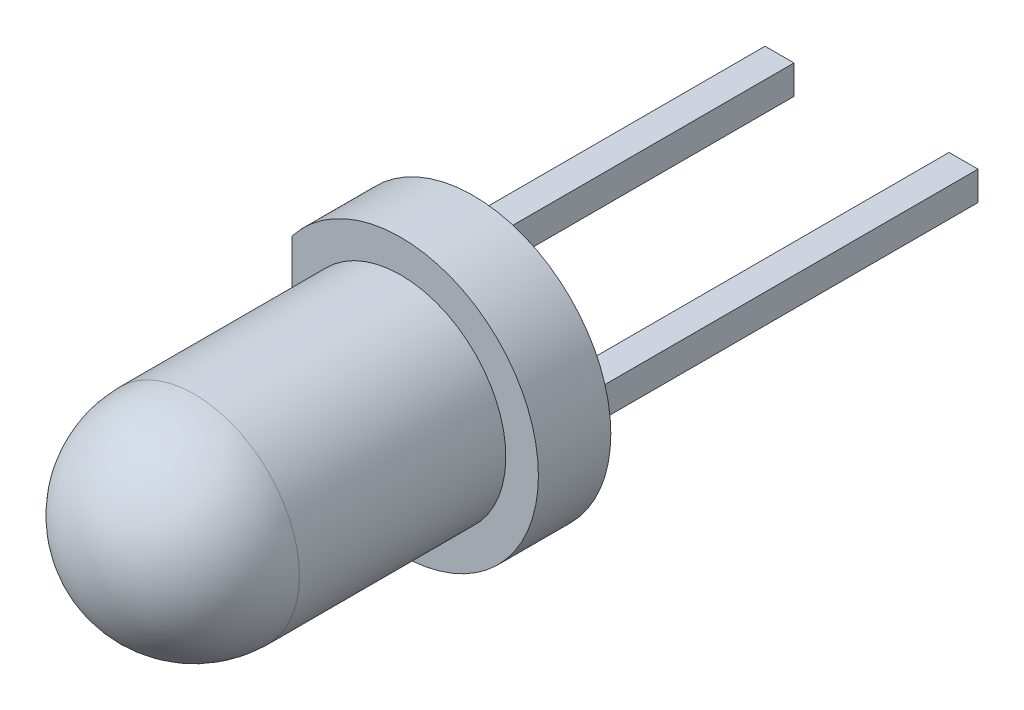
ISO-10303-21;
HEADER;
FILE_DESCRIPTION(('STEP AP214'),'2;1');
FILE_NAME('part.step','',(''),(''),'','','');
FILE_SCHEMA(('AUTOMOTIVE_DESIGN { 1 0 10303 214 1 1 1 1 }'));
ENDSEC;
DATA;
#1=APPLICATION_CONTEXT('core data for automotive mechanical design processes');
#2=APPLICATION_PROTOCOL_DEFINITION('international standard','automotive_design',2000,#1);
#3=PRODUCT_CONTEXT('',#1,'mechanical');
#4=PRODUCT('Part','Part','',(#3));
#5=PRODUCT_RELATED_PRODUCT_CATEGORY('part','',(#4));
#6=PRODUCT_DEFINITION_FORMATION('','',#4);
#7=PRODUCT_DEFINITION_CONTEXT('part definition',#1,'design');
#8=PRODUCT_DEFINITION('design','',#6,#7);
#9=PRODUCT_DEFINITION_SHAPE('','',#8);
#10=(LENGTH_UNIT() NAMED_UNIT(*) SI_UNIT(.MILLI.,.METRE.));
#11=(NAMED_UNIT(*) PLANE_ANGLE_UNIT() SI_UNIT($,.RADIAN.));
#12=(NAMED_UNIT(*) SI_UNIT($,.STERADIAN.) SOLID_ANGLE_UNIT());
#13=UNCERTAINTY_MEASURE_WITH_UNIT(LENGTH_MEASURE(1.E-05),#10,'distance_accuracy_value','');
#14=(GEOMETRIC_REPRESENTATION_CONTEXT(3) GLOBAL_UNCERTAINTY_ASSIGNED_CONTEXT((#13)) GLOBAL_UNIT_ASSIGNED_CONTEXT((#10,
#11,#12)) REPRESENTATION_CONTEXT('',''));
#15=CARTESIAN_POINT('',(0.,0.,0.));
#16=DIRECTION('',(0.,0.,1.));
#17=DIRECTION('',(1.,0.,0.));
#18=AXIS2_PLACEMENT_3D('',#15,#16,#17);
#19=CARTESIAN_POINT('',(73.2,46.9,3.5));
#20=DIRECTION('',(-1.,0.,0.));
#21=DIRECTION('',(0.,0.,1.));
#22=AXIS2_PLACEMENT_3D('',#19,#20,#21);
#23=PLANE('',#22);
#24=DIRECTION('',(0.,1.,0.));
#25=VECTOR('',#24,1.);
#26=CARTESIAN_POINT('',(73.2,46.9,-2.5));
#27=LINE('',#26,#25);
#28=CARTESIAN_POINT('',(73.2,46.5,-2.5));
#29=VERTEX_POINT('',#28);
#30=CARTESIAN_POINT('',(73.2,46.9,-2.5));
#31=VERTEX_POINT('',#30);
#32=EDGE_CURVE('E127',#29,#31,#27,.T.);
#33=ORIENTED_EDGE('',*,*,#32,.T.);
#34=DIRECTION('',(0.,0.,-1.));
#35=VECTOR('',#34,1.);
#36=CARTESIAN_POINT('',(73.2,46.9,3.5));
#37=LINE('',#36,#35);
#38=CARTESIAN_POINT('',(73.2,46.9,3.));
#39=VERTEX_POINT('',#38);
#40=EDGE_CURVE('E119',#31,#39,#37,.F.);
#41=ORIENTED_EDGE('',*,*,#40,.T.);
#42=DIRECTION('',(0.,1.,0.));
#43=VECTOR('',#42,1.);
#44=CARTESIAN_POINT('',(73.2,46.9,3.));
#45=LINE('',#44,#43);
#46=CARTESIAN_POINT('',(73.2,46.5,3.));
#47=VERTEX_POINT('',#46);
#48=EDGE_CURVE('E110',#47,#39,#45,.T.);
#49=ORIENTED_EDGE('',*,*,#48,.F.);
#50=DIRECTION('',(0.,0.,1.));
#51=VECTOR('',#50,1.);
#52=CARTESIAN_POINT('',(73.2,46.5,3.5));
#53=LINE('',#52,#51);
#54=EDGE_CURVE('E103',#47,#29,#53,.F.);
#55=ORIENTED_EDGE('',*,*,#54,.T.);
#56=EDGE_LOOP('',(#33,#41,#49,#55));
#57=FACE_BOUND('',#56,.T.);
#58=ADVANCED_FACE('F17',(#57),#23,.F.);
#59=CARTESIAN_POINT('',(75.74,46.5,3.5));
#60=DIRECTION('',(0.,1.,0.));
#61=DIRECTION('',(0.,0.,1.));
#62=AXIS2_PLACEMENT_3D('',#59,#60,#61);
#63=PLANE('',#62);
#64=DIRECTION('',(1.,0.,0.));
#65=VECTOR('',#64,1.);
#66=CARTESIAN_POINT('',(75.34,46.5,-2.5));
#67=LINE('',#66,#65);
#68=CARTESIAN_POINT('',(75.34,46.5,-2.5));
#69=VERTEX_POINT('',#68);
#70=CARTESIAN_POINT('',(75.74,46.5,-2.5));
#71=VERTEX_POINT('',#70);
#72=EDGE_CURVE('E171',#69,#71,#67,.T.);
#73=ORIENTED_EDGE('',*,*,#72,.T.);
#74=DIRECTION('',(0.,0.,1.));
#75=VECTOR('',#74,1.);
#76=CARTESIAN_POINT('',(75.74,46.5,3.5));
#77=LINE('',#76,#75);
#78=CARTESIAN_POINT('',(75.74,46.5,3.));
#79=VERTEX_POINT('',#78);
#80=EDGE_CURVE('E164',#71,#79,#77,.T.);
#81=ORIENTED_EDGE('',*,*,#80,.T.);
#82=DIRECTION('',(1.,0.,0.));
#83=VECTOR('',#82,1.);
#84=CARTESIAN_POINT('',(75.74,46.5,3.));
#85=LINE('',#84,#83);
#86=CARTESIAN_POINT('',(75.34,46.5,3.));
#87=VERTEX_POINT('',#86);
#88=EDGE_CURVE('E116',#87,#79,#85,.T.);
#89=ORIENTED_EDGE('',*,*,#88,.F.);
#90=DIRECTION('',(0.,0.,-1.));
#91=VECTOR('',#90,1.);
#92=CARTESIAN_POINT('',(75.34,46.5,3.5));
#93=LINE('',#92,#91);
#94=EDGE_CURVE('E176',#87,#69,#93,.T.);
#95=ORIENTED_EDGE('',*,*,#94,.T.);
#96=EDGE_LOOP('',(#73,#81,#89,#95));
#97=FACE_BOUND('',#96,.T.);
#98=ADVANCED_FACE('F238',(#97),#63,.F.);
#99=CARTESIAN_POINT('',(73.2,46.5,3.5));
#100=DIRECTION('',(0.,1.,0.));
#101=DIRECTION('',(0.,0.,1.));
#102=AXIS2_PLACEMENT_3D('',#99,#100,#101);
#103=PLANE('',#102);
#104=DIRECTION('',(1.,0.,0.));
#105=VECTOR('',#104,1.);
#106=CARTESIAN_POINT('',(72.8,46.5,-2.5));
#107=LINE('',#106,#105);
#108=CARTESIAN_POINT('',(72.8,46.5,-2.5));
#109=VERTEX_POINT('',#108);
#110=EDGE_CURVE('E124',#109,#29,#107,.T.);
#111=ORIENTED_EDGE('',*,*,#110,.T.);
#112=ORIENTED_EDGE('',*,*,#54,.F.);
#113=DIRECTION('',(1.,0.,0.));
#114=VECTOR('',#113,1.);
#115=CARTESIAN_POINT('',(73.2,46.5,3.));
#116=LINE('',#115,#114);
#117=CARTESIAN_POINT('',(72.8,46.5,3.));
#118=VERTEX_POINT('',#117);
#119=EDGE_CURVE('E108',#118,#47,#116,.T.);
#120=ORIENTED_EDGE('',*,*,#119,.F.);
#121=DIRECTION('',(0.,0.,-1.));
#122=VECTOR('',#121,1.);
#123=CARTESIAN_POINT('',(72.8,46.5,3.5));
#124=LINE('',#123,#122);
#125=EDGE_CURVE('E162',#118,#109,#124,.T.);
#126=ORIENTED_EDGE('',*,*,#125,.T.);
#127=EDGE_LOOP('',(#111,#112,#120,#126));
#128=FACE_BOUND('',#127,.T.);
#129=ADVANCED_FACE('F122',(#128),#103,.F.);
#130=CARTESIAN_POINT('',(72.8,46.9,-2.5));
#131=DIRECTION('',(0.,0.,1.));
#132=DIRECTION('',(1.,0.,0.));
#133=AXIS2_PLACEMENT_3D('',#130,#131,#132);
#134=PLANE('',#133);
#135=ORIENTED_EDGE('',*,*,#32,.F.);
#136=ORIENTED_EDGE('',*,*,#110,.F.);
#137=DIRECTION('',(0.,1.,0.));
#138=VECTOR('',#137,1.);
#139=CARTESIAN_POINT('',(72.8,46.5,-2.5));
#140=LINE('',#139,#138);
#141=CARTESIAN_POINT('',(72.8,46.9,-2.5));
#142=VERTEX_POINT('',#141);
#143=EDGE_CURVE('E160',#109,#142,#140,.T.);
#144=ORIENTED_EDGE('',*,*,#143,.T.);
#145=DIRECTION('',(1.,0.,0.));
#146=VECTOR('',#145,1.);
#147=CARTESIAN_POINT('',(72.8,46.9,-2.5));
#148=LINE('',#147,#146);
#149=EDGE_CURVE('E181',#142,#31,#148,.T.);
#150=ORIENTED_EDGE('',*,*,#149,.T.);
#151=EDGE_LOOP('',(#135,#136,#144,#150));
#152=FACE_BOUND('',#151,.T.);
#153=ADVANCED_FACE('F187',(#152),#134,.F.);
#154=CARTESIAN_POINT('',(72.8,46.9,3.5));
#155=DIRECTION('',(0.,-1.,0.));
#156=DIRECTION('',(0.,0.,-1.));
#157=AXIS2_PLACEMENT_3D('',#154,#155,#156);
#158=PLANE('',#157);
#159=ORIENTED_EDGE('',*,*,#149,.F.);
#160=DIRECTION('',(0.,0.,-1.));
#161=VECTOR('',#160,1.);
#162=CARTESIAN_POINT('',(72.8,46.9,3.5));
#163=LINE('',#162,#161);
#164=CARTESIAN_POINT('',(72.8,46.9,3.));
#165=VERTEX_POINT('',#164);
#166=EDGE_CURVE('E157',#142,#165,#163,.F.);
#167=ORIENTED_EDGE('',*,*,#166,.T.);
#168=DIRECTION('',(1.,0.,0.));
#169=VECTOR('',#168,1.);
#170=CARTESIAN_POINT('',(72.8,46.9,3.));
#171=LINE('',#170,#169);
#172=EDGE_CURVE('E184',#39,#165,#171,.F.);
#173=ORIENTED_EDGE('',*,*,#172,.F.);
#174=ORIENTED_EDGE('',*,*,#40,.F.);
#175=EDGE_LOOP('',(#159,#167,#173,#174));
#176=FACE_BOUND('',#175,.T.);
#177=ADVANCED_FACE('F191',(#176),#158,.F.);
#178=CARTESIAN_POINT('',(75.34,46.5,3.5));
#179=DIRECTION('',(1.,0.,0.));
#180=DIRECTION('',(0.,0.,-1.));
#181=AXIS2_PLACEMENT_3D('',#178,#179,#180);
#182=PLANE('',#181);
#183=DIRECTION('',(0.,1.,0.));
#184=VECTOR('',#183,1.);
#185=CARTESIAN_POINT('',(75.34,46.9,-2.5));
#186=LINE('',#185,#184);
#187=CARTESIAN_POINT('',(75.34,46.9,-2.5));
#188=VERTEX_POINT('',#187);
#189=EDGE_CURVE('E173',#188,#69,#186,.F.);
#190=ORIENTED_EDGE('',*,*,#189,.T.);
#191=ORIENTED_EDGE('',*,*,#94,.F.);
#192=DIRECTION('',(0.,1.,0.));
#193=VECTOR('',#192,1.);
#194=CARTESIAN_POINT('',(75.34,46.5,3.));
#195=LINE('',#194,#193);
#196=CARTESIAN_POINT('',(75.34,46.9,3.));
#197=VERTEX_POINT('',#196);
#198=EDGE_CURVE('E178',#197,#87,#195,.F.);
#199=ORIENTED_EDGE('',*,*,#198,.F.);
#200=DIRECTION('',(0.,0.,-1.));
#201=VECTOR('',#200,1.);
#202=CARTESIAN_POINT('',(75.34,46.9,3.5));
#203=LINE('',#202,#201);
#204=EDGE_CURVE('E155',#197,#188,#203,.T.);
#205=ORIENTED_EDGE('',*,*,#204,.T.);
#206=EDGE_LOOP('',(#190,#191,#199,#205));
#207=FACE_BOUND('',#206,.T.);
#208=ADVANCED_FACE('F228',(#207),#182,.F.);
#209=CARTESIAN_POINT('',(75.34,46.9,-2.5));
#210=DIRECTION('',(0.,0.,1.));
#211=DIRECTION('',(1.,0.,0.));
#212=AXIS2_PLACEMENT_3D('',#209,#210,#211);
#213=PLANE('',#212);
#214=DIRECTION('',(0.,1.,0.));
#215=VECTOR('',#214,1.);
#216=CARTESIAN_POINT('',(75.74,46.9,-2.5));
#217=LINE('',#216,#215);
#218=CARTESIAN_POINT('',(75.74,46.9,-2.5));
#219=VERTEX_POINT('',#218);
#220=EDGE_CURVE('E167',#219,#71,#217,.F.);
#221=ORIENTED_EDGE('',*,*,#220,.T.);
#222=ORIENTED_EDGE('',*,*,#72,.F.);
#223=ORIENTED_EDGE('',*,*,#189,.F.);
#224=DIRECTION('',(1.,0.,0.));
#225=VECTOR('',#224,1.);
#226=CARTESIAN_POINT('',(75.34,46.9,-2.5));
#227=LINE('',#226,#225);
#228=EDGE_CURVE('E153',#188,#219,#227,.T.);
#229=ORIENTED_EDGE('',*,*,#228,.T.);
#230=EDGE_LOOP('',(#221,#222,#223,#229));
#231=FACE_BOUND('',#230,.T.);
#232=ADVANCED_FACE('F224',(#231),#213,.F.);
#233=CARTESIAN_POINT('',(75.74,46.9,3.5));
#234=DIRECTION('',(-1.,0.,0.));
#235=DIRECTION('',(0.,0.,1.));
#236=AXIS2_PLACEMENT_3D('',#233,#234,#235);
#237=PLANE('',#236);
#238=ORIENTED_EDGE('',*,*,#220,.F.);
#239=DIRECTION('',(0.,0.,-1.));
#240=VECTOR('',#239,1.);
#241=CARTESIAN_POINT('',(75.74,46.9,3.5));
#242=LINE('',#241,#240);
#243=CARTESIAN_POINT('',(75.74,46.9,3.));
#244=VERTEX_POINT('',#243);
#245=EDGE_CURVE('E151',#219,#244,#242,.F.);
#246=ORIENTED_EDGE('',*,*,#245,.T.);
#247=DIRECTION('',(0.,1.,0.));
#248=VECTOR('',#247,1.);
#249=CARTESIAN_POINT('',(75.74,46.9,3.));
#250=LINE('',#249,#248);
#251=EDGE_CURVE('E59',#79,#244,#250,.T.);
#252=ORIENTED_EDGE('',*,*,#251,.F.);
#253=ORIENTED_EDGE('',*,*,#80,.F.);
#254=EDGE_LOOP('',(#238,#246,#252,#253));
#255=FACE_BOUND('',#254,.T.);
#256=ADVANCED_FACE('F221',(#255),#237,.F.);
#257=CARTESIAN_POINT('',(72.8,46.5,3.5));
#258=DIRECTION('',(1.,0.,0.));
#259=DIRECTION('',(0.,0.,-1.));
#260=AXIS2_PLACEMENT_3D('',#257,#258,#259);
#261=PLANE('',#260);
#262=ORIENTED_EDGE('',*,*,#143,.F.);
#263=ORIENTED_EDGE('',*,*,#125,.F.);
#264=DIRECTION('',(0.,1.,0.));
#265=VECTOR('',#264,1.);
#266=CARTESIAN_POINT('',(72.8,45.533809621031,3.));
#267=LINE('',#266,#265);
#268=EDGE_CURVE('E113',#165,#118,#267,.F.);
#269=ORIENTED_EDGE('',*,*,#268,.F.);
#270=ORIENTED_EDGE('',*,*,#166,.F.);
#271=EDGE_LOOP('',(#262,#263,#269,#270));
#272=FACE_BOUND('',#271,.T.);
#273=ADVANCED_FACE('F193',(#272),#261,.F.);
#274=CARTESIAN_POINT('',(75.34,46.9,3.5));
#275=DIRECTION('',(0.,-1.,0.));
#276=DIRECTION('',(0.,0.,-1.));
#277=AXIS2_PLACEMENT_3D('',#274,#275,#276);
#278=PLANE('',#277);
#279=ORIENTED_EDGE('',*,*,#228,.F.);
#280=ORIENTED_EDGE('',*,*,#204,.F.);
#281=DIRECTION('',(-1.,0.,0.));
#282=VECTOR('',#281,1.);
#283=CARTESIAN_POINT('',(72.77,46.9,3.));
#284=LINE('',#283,#282);
#285=EDGE_CURVE('E194',#244,#197,#284,.T.);
#286=ORIENTED_EDGE('',*,*,#285,.F.);
#287=ORIENTED_EDGE('',*,*,#245,.F.);
#288=EDGE_LOOP('',(#279,#280,#286,#287));
#289=FACE_BOUND('',#288,.T.);
#290=ADVANCED_FACE('F215',(#289),#278,.F.);
#291=CARTESIAN_POINT('',(72.77,45.533809621031,3.));
#292=DIRECTION('',(0.,0.,-1.));
#293=DIRECTION('',(-1.,0.,0.));
#294=AXIS2_PLACEMENT_3D('',#291,#292,#293);
#295=PLANE('',#294);
#296=ORIENTED_EDGE('',*,*,#251,.T.);
#297=ORIENTED_EDGE('',*,*,#285,.T.);
#298=ORIENTED_EDGE('',*,*,#198,.T.);
#299=ORIENTED_EDGE('',*,*,#88,.T.);
#300=EDGE_LOOP('',(#296,#297,#298,#299));
#301=FACE_BOUND('',#300,.T.);
#302=ORIENTED_EDGE('',*,*,#172,.T.);
#303=ORIENTED_EDGE('',*,*,#268,.T.);
#304=ORIENTED_EDGE('',*,*,#119,.T.);
#305=ORIENTED_EDGE('',*,*,#48,.T.);
#306=EDGE_LOOP('',(#302,#303,#304,#305));
#307=FACE_BOUND('',#306,.T.);
#308=CARTESIAN_POINT('',(74.27,46.7,3.));
#309=DIRECTION('',(0.,0.,-1.));
#310=DIRECTION('',(-1.,0.,0.));
#311=AXIS2_PLACEMENT_3D('',#308,#309,#310);
#312=CIRCLE('',#311,1.9);
#313=CARTESIAN_POINT('',(72.77,45.5338096210305,3.));
#314=VERTEX_POINT('',#313);
#315=CARTESIAN_POINT('',(72.77,47.8661903789695,3.));
#316=VERTEX_POINT('',#315);
#317=EDGE_CURVE('E20',#314,#316,#312,.F.);
#318=ORIENTED_EDGE('',*,*,#317,.F.);
#319=DIRECTION('',(0.,1.,0.));
#320=VECTOR('',#319,1.);
#321=CARTESIAN_POINT('',(72.77,45.53380962103,3.));
#322=LINE('',#321,#320);
#323=EDGE_CURVE('E135',#316,#314,#322,.F.);
#324=ORIENTED_EDGE('',*,*,#323,.F.);
#325=EDGE_LOOP('',(#318,#324));
#326=FACE_BOUND('',#325,.T.);
#327=ADVANCED_FACE('F109',(#301,#307,#326),#295,.T.);
#328=CARTESIAN_POINT('',(74.27,46.7,3.));
#329=DIRECTION('',(0.,0.,-1.));
#330=DIRECTION('',(-1.,0.,0.));
#331=AXIS2_PLACEMENT_3D('',#328,#329,#330);
#332=CYLINDRICAL_SURFACE('',#331,1.9);
#333=CARTESIAN_POINT('',(74.27,46.7,4.));
#334=DIRECTION('',(0.,0.,-1.));
#335=DIRECTION('',(-1.,0.,0.));
#336=AXIS2_PLACEMENT_3D('',#333,#334,#335);
#337=CIRCLE('',#336,1.9);
#338=CARTESIAN_POINT('',(72.77,47.8661903789695,4.));
#339=VERTEX_POINT('',#338);
#340=CARTESIAN_POINT('',(72.77,45.5338096210305,4.));
#341=VERTEX_POINT('',#340);
#342=EDGE_CURVE('E133',#339,#341,#337,.T.);
#343=ORIENTED_EDGE('',*,*,#342,.T.);
#344=DIRECTION('',(0.,0.,1.));
#345=VECTOR('',#344,1.);
#346=CARTESIAN_POINT('',(72.77,45.53380962103,3.));
#347=LINE('',#346,#345);
#348=EDGE_CURVE('E146',#314,#341,#347,.T.);
#349=ORIENTED_EDGE('',*,*,#348,.F.);
#350=ORIENTED_EDGE('',*,*,#317,.T.);
#351=DIRECTION('',(0.,0.,1.));
#352=VECTOR('',#351,1.);
#353=CARTESIAN_POINT('',(72.77,47.86619037897,3.));
#354=LINE('',#353,#352);
#355=EDGE_CURVE('E142',#339,#316,#354,.F.);
#356=ORIENTED_EDGE('',*,*,#355,.F.);
#357=EDGE_LOOP('',(#343,#349,#350,#356));
#358=FACE_BOUND('',#357,.T.);
#359=ADVANCED_FACE('F210',(#358),#332,.T.);
#360=CARTESIAN_POINT('',(72.77,45.53380962103,3.));
#361=DIRECTION('',(-1.,0.,0.));
#362=DIRECTION('',(0.,0.,1.));
#363=AXIS2_PLACEMENT_3D('',#360,#361,#362);
#364=PLANE('',#363);
#365=ORIENTED_EDGE('',*,*,#355,.T.);
#366=ORIENTED_EDGE('',*,*,#323,.T.);
#367=ORIENTED_EDGE('',*,*,#348,.T.);
#368=DIRECTION('',(0.,1.,0.));
#369=VECTOR('',#368,1.);
#370=CARTESIAN_POINT('',(72.77,45.533809621031,4.));
#371=LINE('',#370,#369);
#372=EDGE_CURVE('E134',#341,#339,#371,.T.);
#373=ORIENTED_EDGE('',*,*,#372,.T.);
#374=EDGE_LOOP('',(#365,#366,#367,#373));
#375=FACE_BOUND('',#374,.T.);
#376=ADVANCED_FACE('F206',(#375),#364,.T.);
#377=CARTESIAN_POINT('',(74.27,46.7,6.85));
#378=DIRECTION('',(1.,0.,0.));
#379=DIRECTION('',(0.,1.,0.));
#380=AXIS2_PLACEMENT_3D('',#377,#378,#379);
#381=SPHERICAL_SURFACE('',#380,1.45);
#382=CARTESIAN_POINT('',(74.27,46.7,6.85));
#383=DIRECTION('',(0.,0.,-1.));
#384=DIRECTION('',(0.,1.,0.));
#385=AXIS2_PLACEMENT_3D('',#382,#383,#384);
#386=CIRCLE('',#385,1.45);
#387=CARTESIAN_POINT('',(75.72,46.7,6.85));
#388=VERTEX_POINT('',#387);
#389=CARTESIAN_POINT('',(72.82,46.7,6.85));
#390=VERTEX_POINT('',#389);
#391=EDGE_CURVE('E132',#388,#390,#386,.T.);
#392=ORIENTED_EDGE('',*,*,#391,.F.);
#393=CARTESIAN_POINT('',(74.27,46.7,6.85));
#394=DIRECTION('',(0.,0.,-1.));
#395=DIRECTION('',(0.,1.,0.));
#396=AXIS2_PLACEMENT_3D('',#393,#394,#395);
#397=CIRCLE('',#396,1.45);
#398=EDGE_CURVE('E26',#390,#388,#397,.T.);
#399=ORIENTED_EDGE('',*,*,#398,.F.);
#400=EDGE_LOOP('',(#392,#399));
#401=FACE_BOUND('',#400,.T.);
#402=ADVANCED_FACE('F201',(#401),#381,.T.);
#403=CARTESIAN_POINT('',(72.77,45.533809621031,4.));
#404=DIRECTION('',(0.,0.,-1.));
#405=DIRECTION('',(-1.,0.,0.));
#406=AXIS2_PLACEMENT_3D('',#403,#404,#405);
#407=PLANE('',#406);
#408=CARTESIAN_POINT('',(74.27,46.7,4.));
#409=DIRECTION('',(0.,0.,-1.));
#410=DIRECTION('',(0.,1.,0.));
#411=AXIS2_PLACEMENT_3D('',#408,#409,#410);
#412=CIRCLE('',#411,1.45);
#413=CARTESIAN_POINT('',(74.27,48.15,4.));
#414=VERTEX_POINT('',#413);
#415=EDGE_CURVE('E11',#414,#414,#412,.F.);
#416=ORIENTED_EDGE('',*,*,#415,.F.);
#417=EDGE_LOOP('',(#416));
#418=FACE_BOUND('',#417,.T.);
#419=ORIENTED_EDGE('',*,*,#342,.F.);
#420=ORIENTED_EDGE('',*,*,#372,.F.);
#421=EDGE_LOOP('',(#419,#420));
#422=FACE_BOUND('',#421,.T.);
#423=ADVANCED_FACE('F205',(#418,#422),#407,.F.);
#424=CARTESIAN_POINT('',(74.27,46.7,6.85));
#425=DIRECTION('',(0.,0.,-1.));
#426=DIRECTION('',(0.,1.,0.));
#427=AXIS2_PLACEMENT_3D('',#424,#425,#426);
#428=CYLINDRICAL_SURFACE('',#427,1.45);
#429=ORIENTED_EDGE('',*,*,#398,.T.);
#430=ORIENTED_EDGE('',*,*,#391,.T.);
#431=EDGE_LOOP('',(#429,#430));
#432=FACE_BOUND('',#431,.T.);
#433=ORIENTED_EDGE('',*,*,#415,.T.);
#434=EDGE_LOOP('',(#433));
#435=FACE_BOUND('',#434,.T.);
#436=ADVANCED_FACE('F245',(#432,#435),#428,.T.);
#437=CLOSED_SHELL('',(#58,#98,#129,#153,#177,#208,#232,#256,#273,#290,#327,#359,#376,#402,#423,#436));
#438=MANIFOLD_SOLID_BREP('B1',#437);
#439=ADVANCED_BREP_SHAPE_REPRESENTATION('',(#18,#438),#14);
#440=SHAPE_DEFINITION_REPRESENTATION(#9,#439);
ENDSEC;
END-ISO-10303-21;
